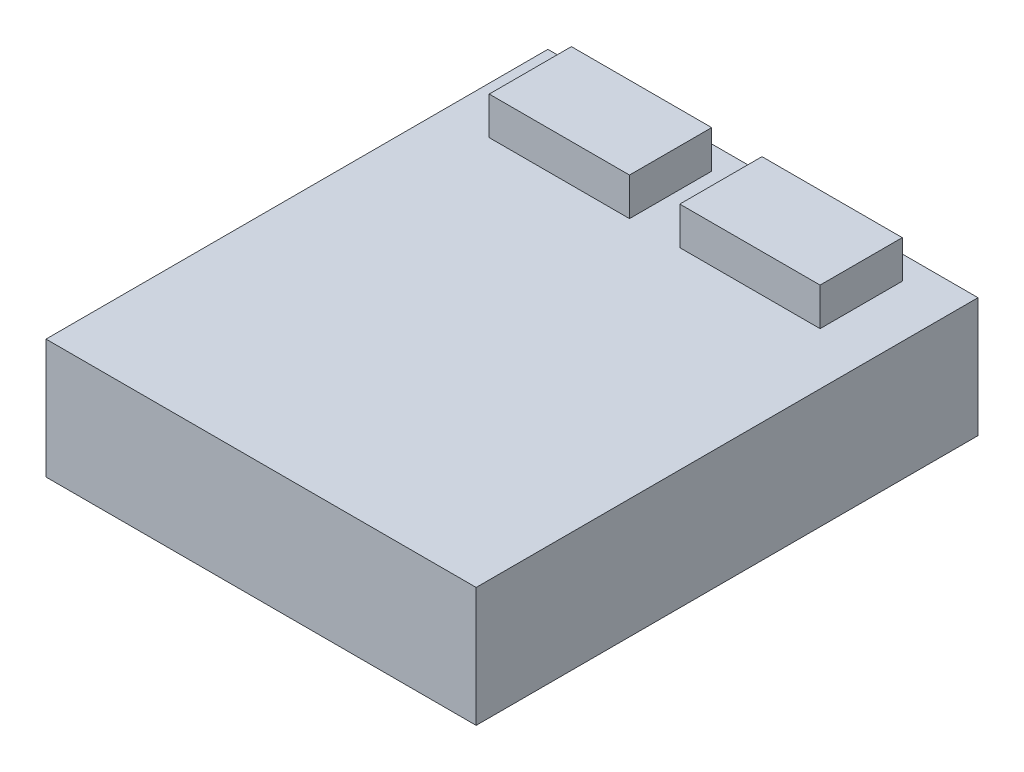
ISO-10303-21;
HEADER;
FILE_DESCRIPTION(('STEP AP214'),'2;1');
FILE_NAME('part.step','',(''),(''),'','','');
FILE_SCHEMA(('AUTOMOTIVE_DESIGN { 1 0 10303 214 1 1 1 1 }'));
ENDSEC;
DATA;
#1=APPLICATION_CONTEXT('core data for automotive mechanical design processes');
#2=APPLICATION_PROTOCOL_DEFINITION('international standard','automotive_design',2000,#1);
#3=PRODUCT_CONTEXT('',#1,'mechanical');
#4=PRODUCT('Part','Part','',(#3));
#5=PRODUCT_RELATED_PRODUCT_CATEGORY('part','',(#4));
#6=PRODUCT_DEFINITION_FORMATION('','',#4);
#7=PRODUCT_DEFINITION_CONTEXT('part definition',#1,'design');
#8=PRODUCT_DEFINITION('design','',#6,#7);
#9=PRODUCT_DEFINITION_SHAPE('','',#8);
#10=(LENGTH_UNIT() NAMED_UNIT(*) SI_UNIT(.MILLI.,.METRE.));
#11=(NAMED_UNIT(*) PLANE_ANGLE_UNIT() SI_UNIT($,.RADIAN.));
#12=(NAMED_UNIT(*) SI_UNIT($,.STERADIAN.) SOLID_ANGLE_UNIT());
#13=UNCERTAINTY_MEASURE_WITH_UNIT(LENGTH_MEASURE(1.E-05),#10,'distance_accuracy_value','');
#14=(GEOMETRIC_REPRESENTATION_CONTEXT(3) GLOBAL_UNCERTAINTY_ASSIGNED_CONTEXT((#13)) GLOBAL_UNIT_ASSIGNED_CONTEXT((#10,
#11,#12)) REPRESENTATION_CONTEXT('',''));
#15=CARTESIAN_POINT('',(0.,0.,0.));
#16=DIRECTION('',(0.,0.,1.));
#17=DIRECTION('',(1.,0.,0.));
#18=AXIS2_PLACEMENT_3D('',#15,#16,#17);
#19=CARTESIAN_POINT('',(0.,250.,0.));
#20=DIRECTION('',(0.,-1.,0.));
#21=DIRECTION('',(0.,0.,-1.));
#22=AXIS2_PLACEMENT_3D('',#19,#20,#21);
#23=PLANE('',#22);
#24=DIRECTION('',(0.,0.,1.));
#25=VECTOR('',#24,1.);
#26=CARTESIAN_POINT('',(197.381270116328,250.,-2001.22657109094));
#27=LINE('',#26,#25);
#28=CARTESIAN_POINT('',(197.381270116328,250.,-2001.22657109094));
#29=VERTEX_POINT('',#28);
#30=CARTESIAN_POINT('',(197.381270116328,250.,-1657.32879612678));
#31=VERTEX_POINT('',#30);
#32=EDGE_CURVE('E153',#29,#31,#27,.T.);
#33=ORIENTED_EDGE('',*,*,#32,.F.);
#34=DIRECTION('',(-1.,0.,0.));
#35=VECTOR('',#34,1.);
#36=CARTESIAN_POINT('',(197.381270116328,250.,-2001.22657109094));
#37=LINE('',#36,#35);
#38=CARTESIAN_POINT('',(784.379196348257,250.,-2001.22657109094));
#39=VERTEX_POINT('',#38);
#40=EDGE_CURVE('E169',#39,#29,#37,.T.);
#41=ORIENTED_EDGE('',*,*,#40,.F.);
#42=DIRECTION('',(0.,0.,-1.));
#43=VECTOR('',#42,1.);
#44=CARTESIAN_POINT('',(784.379196348257,250.,-2001.22657109094));
#45=LINE('',#44,#43);
#46=CARTESIAN_POINT('',(784.379196348257,250.,-1657.32879612678));
#47=VERTEX_POINT('',#46);
#48=EDGE_CURVE('E182',#47,#39,#45,.T.);
#49=ORIENTED_EDGE('',*,*,#48,.F.);
#50=DIRECTION('',(1.,0.,0.));
#51=VECTOR('',#50,1.);
#52=CARTESIAN_POINT('',(197.381270116328,250.,-1657.32879612678));
#53=LINE('',#52,#51);
#54=EDGE_CURVE('E158',#31,#47,#53,.T.);
#55=ORIENTED_EDGE('',*,*,#54,.F.);
#56=EDGE_LOOP('',(#33,#41,#49,#55));
#57=FACE_BOUND('',#56,.T.);
#58=DIRECTION('',(0.,0.,1.));
#59=VECTOR('',#58,1.);
#60=CARTESIAN_POINT('',(0.,250.,0.));
#61=LINE('',#60,#59);
#62=CARTESIAN_POINT('',(0.,250.,-2100.));
#63=VERTEX_POINT('',#62);
#64=CARTESIAN_POINT('',(0.,250.,0.));
#65=VERTEX_POINT('',#64);
#66=EDGE_CURVE('E205',#63,#65,#61,.T.);
#67=ORIENTED_EDGE('',*,*,#66,.T.);
#68=DIRECTION('',(1.,0.,0.));
#69=VECTOR('',#68,1.);
#70=CARTESIAN_POINT('',(0.,250.,0.));
#71=LINE('',#70,#69);
#72=CARTESIAN_POINT('',(1800.,250.,0.));
#73=VERTEX_POINT('',#72);
#74=EDGE_CURVE('E209',#65,#73,#71,.T.);
#75=ORIENTED_EDGE('',*,*,#74,.T.);
#76=DIRECTION('',(0.,0.,-1.));
#77=VECTOR('',#76,1.);
#78=CARTESIAN_POINT('',(1800.,250.,0.));
#79=LINE('',#78,#77);
#80=CARTESIAN_POINT('',(1800.,250.,-2100.));
#81=VERTEX_POINT('',#80);
#82=EDGE_CURVE('E213',#73,#81,#79,.T.);
#83=ORIENTED_EDGE('',*,*,#82,.T.);
#84=DIRECTION('',(-1.,0.,0.));
#85=VECTOR('',#84,1.);
#86=CARTESIAN_POINT('',(0.,250.,-2100.));
#87=LINE('',#86,#85);
#88=EDGE_CURVE('E216',#81,#63,#87,.T.);
#89=ORIENTED_EDGE('',*,*,#88,.T.);
#90=EDGE_LOOP('',(#67,#75,#83,#89));
#91=FACE_BOUND('',#90,.T.);
#92=DIRECTION('',(0.,0.,1.));
#93=VECTOR('',#92,1.);
#94=CARTESIAN_POINT('',(994.868351714251,250.,-2001.22657109094));
#95=LINE('',#94,#93);
#96=CARTESIAN_POINT('',(994.868351714251,250.,-2001.22657109094));
#97=VERTEX_POINT('',#96);
#98=CARTESIAN_POINT('',(994.868351714251,250.,-1657.32879612678));
#99=VERTEX_POINT('',#98);
#100=EDGE_CURVE('E151',#97,#99,#95,.T.);
#101=ORIENTED_EDGE('',*,*,#100,.F.);
#102=DIRECTION('',(-1.,0.,0.));
#103=VECTOR('',#102,1.);
#104=CARTESIAN_POINT('',(994.868351714251,250.,-2001.22657109094));
#105=LINE('',#104,#103);
#106=CARTESIAN_POINT('',(1581.86627794618,250.,-2001.22657109094));
#107=VERTEX_POINT('',#106);
#108=EDGE_CURVE('E148',#107,#97,#105,.T.);
#109=ORIENTED_EDGE('',*,*,#108,.F.);
#110=DIRECTION('',(0.,0.,-1.));
#111=VECTOR('',#110,1.);
#112=CARTESIAN_POINT('',(1581.86627794618,250.,-2001.22657109094));
#113=LINE('',#112,#111);
#114=CARTESIAN_POINT('',(1581.86627794618,250.,-1657.32879612678));
#115=VERTEX_POINT('',#114);
#116=EDGE_CURVE('E60',#115,#107,#113,.T.);
#117=ORIENTED_EDGE('',*,*,#116,.F.);
#118=DIRECTION('',(1.,0.,0.));
#119=VECTOR('',#118,1.);
#120=CARTESIAN_POINT('',(994.868351714251,250.,-1657.32879612678));
#121=LINE('',#120,#119);
#122=EDGE_CURVE('E55',#99,#115,#121,.T.);
#123=ORIENTED_EDGE('',*,*,#122,.F.);
#124=EDGE_LOOP('',(#101,#109,#117,#123));
#125=FACE_BOUND('',#124,.T.);
#126=ADVANCED_FACE('F39',(#57,#91,#125),#23,.F.);
#127=CARTESIAN_POINT('',(0.,250.,0.));
#128=DIRECTION('',(1.,0.,0.));
#129=DIRECTION('',(0.,0.,-1.));
#130=AXIS2_PLACEMENT_3D('',#127,#128,#129);
#131=PLANE('',#130);
#132=DIRECTION('',(0.,0.,1.));
#133=VECTOR('',#132,1.);
#134=CARTESIAN_POINT('',(0.,-250.,0.));
#135=LINE('',#134,#133);
#136=CARTESIAN_POINT('',(0.,-250.,-2100.));
#137=VERTEX_POINT('',#136);
#138=CARTESIAN_POINT('',(0.,-250.,0.));
#139=VERTEX_POINT('',#138);
#140=EDGE_CURVE('E204',#137,#139,#135,.T.);
#141=ORIENTED_EDGE('',*,*,#140,.T.);
#142=DIRECTION('',(0.,-1.,0.));
#143=VECTOR('',#142,1.);
#144=CARTESIAN_POINT('',(0.,250.,0.));
#145=LINE('',#144,#143);
#146=EDGE_CURVE('E11',#65,#139,#145,.T.);
#147=ORIENTED_EDGE('',*,*,#146,.F.);
#148=ORIENTED_EDGE('',*,*,#66,.F.);
#149=DIRECTION('',(0.,-1.,0.));
#150=VECTOR('',#149,1.);
#151=CARTESIAN_POINT('',(0.,250.,-2100.));
#152=LINE('',#151,#150);
#153=EDGE_CURVE('E219',#63,#137,#152,.T.);
#154=ORIENTED_EDGE('',*,*,#153,.T.);
#155=EDGE_LOOP('',(#141,#147,#148,#154));
#156=FACE_BOUND('',#155,.T.);
#157=ADVANCED_FACE('F41',(#156),#131,.F.);
#158=CARTESIAN_POINT('',(0.,250.,0.));
#159=DIRECTION('',(0.,0.,-1.));
#160=DIRECTION('',(-1.,0.,0.));
#161=AXIS2_PLACEMENT_3D('',#158,#159,#160);
#162=PLANE('',#161);
#163=DIRECTION('',(1.,0.,0.));
#164=VECTOR('',#163,1.);
#165=CARTESIAN_POINT('',(0.,-250.,0.));
#166=LINE('',#165,#164);
#167=CARTESIAN_POINT('',(1800.,-250.,0.));
#168=VERTEX_POINT('',#167);
#169=EDGE_CURVE('E223',#139,#168,#166,.T.);
#170=ORIENTED_EDGE('',*,*,#169,.T.);
#171=DIRECTION('',(0.,-1.,0.));
#172=VECTOR('',#171,1.);
#173=CARTESIAN_POINT('',(1800.,250.,0.));
#174=LINE('',#173,#172);
#175=EDGE_CURVE('E48',#73,#168,#174,.T.);
#176=ORIENTED_EDGE('',*,*,#175,.F.);
#177=ORIENTED_EDGE('',*,*,#74,.F.);
#178=ORIENTED_EDGE('',*,*,#146,.T.);
#179=EDGE_LOOP('',(#170,#176,#177,#178));
#180=FACE_BOUND('',#179,.T.);
#181=ADVANCED_FACE('F258',(#180),#162,.F.);
#182=CARTESIAN_POINT('',(1800.,250.,0.));
#183=DIRECTION('',(-1.,0.,0.));
#184=DIRECTION('',(0.,0.,1.));
#185=AXIS2_PLACEMENT_3D('',#182,#183,#184);
#186=PLANE('',#185);
#187=DIRECTION('',(0.,0.,-1.));
#188=VECTOR('',#187,1.);
#189=CARTESIAN_POINT('',(1800.,-250.,0.));
#190=LINE('',#189,#188);
#191=CARTESIAN_POINT('',(1800.,-250.,-2100.));
#192=VERTEX_POINT('',#191);
#193=EDGE_CURVE('E226',#168,#192,#190,.T.);
#194=ORIENTED_EDGE('',*,*,#193,.T.);
#195=DIRECTION('',(0.,-1.,0.));
#196=VECTOR('',#195,1.);
#197=CARTESIAN_POINT('',(1800.,250.,-2100.));
#198=LINE('',#197,#196);
#199=EDGE_CURVE('E234',#81,#192,#198,.T.);
#200=ORIENTED_EDGE('',*,*,#199,.F.);
#201=ORIENTED_EDGE('',*,*,#82,.F.);
#202=ORIENTED_EDGE('',*,*,#175,.T.);
#203=EDGE_LOOP('',(#194,#200,#201,#202));
#204=FACE_BOUND('',#203,.T.);
#205=ADVANCED_FACE('F243',(#204),#186,.F.);
#206=CARTESIAN_POINT('',(0.,250.,-2100.));
#207=DIRECTION('',(0.,0.,1.));
#208=DIRECTION('',(1.,0.,0.));
#209=AXIS2_PLACEMENT_3D('',#206,#207,#208);
#210=PLANE('',#209);
#211=DIRECTION('',(-1.,0.,0.));
#212=VECTOR('',#211,1.);
#213=CARTESIAN_POINT('',(0.,-250.,-2100.));
#214=LINE('',#213,#212);
#215=EDGE_CURVE('E210',#192,#137,#214,.T.);
#216=ORIENTED_EDGE('',*,*,#215,.T.);
#217=ORIENTED_EDGE('',*,*,#153,.F.);
#218=ORIENTED_EDGE('',*,*,#88,.F.);
#219=ORIENTED_EDGE('',*,*,#199,.T.);
#220=EDGE_LOOP('',(#216,#217,#218,#219));
#221=FACE_BOUND('',#220,.T.);
#222=ADVANCED_FACE('F252',(#221),#210,.F.);
#223=CARTESIAN_POINT('',(0.,-250.,0.));
#224=DIRECTION('',(0.,-1.,0.));
#225=DIRECTION('',(0.,0.,-1.));
#226=AXIS2_PLACEMENT_3D('',#223,#224,#225);
#227=PLANE('',#226);
#228=ORIENTED_EDGE('',*,*,#140,.F.);
#229=ORIENTED_EDGE('',*,*,#215,.F.);
#230=ORIENTED_EDGE('',*,*,#193,.F.);
#231=ORIENTED_EDGE('',*,*,#169,.F.);
#232=EDGE_LOOP('',(#228,#229,#230,#231));
#233=FACE_BOUND('',#232,.T.);
#234=ADVANCED_FACE('F249',(#233),#227,.T.);
#235=CARTESIAN_POINT('',(197.381270116328,408.,-2001.22657109094));
#236=DIRECTION('',(1.,0.,0.));
#237=DIRECTION('',(0.,0.,-1.));
#238=AXIS2_PLACEMENT_3D('',#235,#236,#237);
#239=PLANE('',#238);
#240=ORIENTED_EDGE('',*,*,#32,.T.);
#241=DIRECTION('',(0.,-1.,0.));
#242=VECTOR('',#241,1.);
#243=CARTESIAN_POINT('',(197.381270116328,408.,-1657.32879612678));
#244=LINE('',#243,#242);
#245=CARTESIAN_POINT('',(197.381270116328,408.,-1657.32879612678));
#246=VERTEX_POINT('',#245);
#247=EDGE_CURVE('E200',#246,#31,#244,.T.);
#248=ORIENTED_EDGE('',*,*,#247,.F.);
#249=DIRECTION('',(0.,0.,1.));
#250=VECTOR('',#249,1.);
#251=CARTESIAN_POINT('',(197.381270116328,408.,-2001.22657109094));
#252=LINE('',#251,#250);
#253=CARTESIAN_POINT('',(197.381270116328,408.,-2001.22657109094));
#254=VERTEX_POINT('',#253);
#255=EDGE_CURVE('E164',#254,#246,#252,.T.);
#256=ORIENTED_EDGE('',*,*,#255,.F.);
#257=DIRECTION('',(0.,-1.,0.));
#258=VECTOR('',#257,1.);
#259=CARTESIAN_POINT('',(197.381270116328,408.,-2001.22657109094));
#260=LINE('',#259,#258);
#261=EDGE_CURVE('E177',#254,#29,#260,.T.);
#262=ORIENTED_EDGE('',*,*,#261,.T.);
#263=EDGE_LOOP('',(#240,#248,#256,#262));
#264=FACE_BOUND('',#263,.T.);
#265=ADVANCED_FACE('F274',(#264),#239,.F.);
#266=CARTESIAN_POINT('',(197.381270116328,408.,-1657.32879612678));
#267=DIRECTION('',(0.,0.,-1.));
#268=DIRECTION('',(-1.,0.,0.));
#269=AXIS2_PLACEMENT_3D('',#266,#267,#268);
#270=PLANE('',#269);
#271=ORIENTED_EDGE('',*,*,#54,.T.);
#272=DIRECTION('',(0.,-1.,0.));
#273=VECTOR('',#272,1.);
#274=CARTESIAN_POINT('',(784.379196348257,408.,-1657.32879612678));
#275=LINE('',#274,#273);
#276=CARTESIAN_POINT('',(784.379196348257,408.,-1657.32879612678));
#277=VERTEX_POINT('',#276);
#278=EDGE_CURVE('E196',#277,#47,#275,.T.);
#279=ORIENTED_EDGE('',*,*,#278,.F.);
#280=DIRECTION('',(1.,0.,0.));
#281=VECTOR('',#280,1.);
#282=CARTESIAN_POINT('',(197.381270116328,408.,-1657.32879612678));
#283=LINE('',#282,#281);
#284=EDGE_CURVE('E168',#246,#277,#283,.T.);
#285=ORIENTED_EDGE('',*,*,#284,.F.);
#286=ORIENTED_EDGE('',*,*,#247,.T.);
#287=EDGE_LOOP('',(#271,#279,#285,#286));
#288=FACE_BOUND('',#287,.T.);
#289=ADVANCED_FACE('F296',(#288),#270,.F.);
#290=CARTESIAN_POINT('',(784.379196348257,408.,-2001.22657109094));
#291=DIRECTION('',(-1.,0.,0.));
#292=DIRECTION('',(0.,0.,1.));
#293=AXIS2_PLACEMENT_3D('',#290,#291,#292);
#294=PLANE('',#293);
#295=ORIENTED_EDGE('',*,*,#48,.T.);
#296=DIRECTION('',(0.,-1.,0.));
#297=VECTOR('',#296,1.);
#298=CARTESIAN_POINT('',(784.379196348257,408.,-2001.22657109094));
#299=LINE('',#298,#297);
#300=CARTESIAN_POINT('',(784.379196348257,408.,-2001.22657109094));
#301=VERTEX_POINT('',#300);
#302=EDGE_CURVE('E192',#301,#39,#299,.T.);
#303=ORIENTED_EDGE('',*,*,#302,.F.);
#304=DIRECTION('',(0.,0.,-1.));
#305=VECTOR('',#304,1.);
#306=CARTESIAN_POINT('',(784.379196348257,408.,-2001.22657109094));
#307=LINE('',#306,#305);
#308=EDGE_CURVE('E172',#277,#301,#307,.T.);
#309=ORIENTED_EDGE('',*,*,#308,.F.);
#310=ORIENTED_EDGE('',*,*,#278,.T.);
#311=EDGE_LOOP('',(#295,#303,#309,#310));
#312=FACE_BOUND('',#311,.T.);
#313=ADVANCED_FACE('F302',(#312),#294,.F.);
#314=CARTESIAN_POINT('',(197.381270116328,408.,-2001.22657109094));
#315=DIRECTION('',(0.,0.,1.));
#316=DIRECTION('',(1.,0.,0.));
#317=AXIS2_PLACEMENT_3D('',#314,#315,#316);
#318=PLANE('',#317);
#319=ORIENTED_EDGE('',*,*,#40,.T.);
#320=ORIENTED_EDGE('',*,*,#261,.F.);
#321=DIRECTION('',(-1.,0.,0.));
#322=VECTOR('',#321,1.);
#323=CARTESIAN_POINT('',(197.381270116328,408.,-2001.22657109094));
#324=LINE('',#323,#322);
#325=EDGE_CURVE('E175',#301,#254,#324,.T.);
#326=ORIENTED_EDGE('',*,*,#325,.F.);
#327=ORIENTED_EDGE('',*,*,#302,.T.);
#328=EDGE_LOOP('',(#319,#320,#326,#327));
#329=FACE_BOUND('',#328,.T.);
#330=ADVANCED_FACE('F309',(#329),#318,.F.);
#331=CARTESIAN_POINT('',(0.,408.,0.));
#332=DIRECTION('',(0.,1.,0.));
#333=DIRECTION('',(0.,0.,1.));
#334=AXIS2_PLACEMENT_3D('',#331,#332,#333);
#335=PLANE('',#334);
#336=ORIENTED_EDGE('',*,*,#255,.T.);
#337=ORIENTED_EDGE('',*,*,#284,.T.);
#338=ORIENTED_EDGE('',*,*,#308,.T.);
#339=ORIENTED_EDGE('',*,*,#325,.T.);
#340=EDGE_LOOP('',(#336,#337,#338,#339));
#341=FACE_BOUND('',#340,.T.);
#342=ADVANCED_FACE('F317',(#341),#335,.T.);
#343=CARTESIAN_POINT('',(994.868351714251,408.,-2001.22657109094));
#344=DIRECTION('',(1.,0.,0.));
#345=DIRECTION('',(0.,0.,-1.));
#346=AXIS2_PLACEMENT_3D('',#343,#344,#345);
#347=PLANE('',#346);
#348=ORIENTED_EDGE('',*,*,#100,.T.);
#349=DIRECTION('',(0.,-1.,0.));
#350=VECTOR('',#349,1.);
#351=CARTESIAN_POINT('',(994.868351714251,408.,-1657.32879612678));
#352=LINE('',#351,#350);
#353=CARTESIAN_POINT('',(994.868351714251,408.,-1657.32879612678));
#354=VERTEX_POINT('',#353);
#355=EDGE_CURVE('E130',#354,#99,#352,.T.);
#356=ORIENTED_EDGE('',*,*,#355,.F.);
#357=DIRECTION('',(0.,0.,1.));
#358=VECTOR('',#357,1.);
#359=CARTESIAN_POINT('',(994.868351714251,408.,-2001.22657109094));
#360=LINE('',#359,#358);
#361=CARTESIAN_POINT('',(994.868351714251,408.,-2001.22657109094));
#362=VERTEX_POINT('',#361);
#363=EDGE_CURVE('E138',#362,#354,#360,.T.);
#364=ORIENTED_EDGE('',*,*,#363,.F.);
#365=DIRECTION('',(0.,-1.,0.));
#366=VECTOR('',#365,1.);
#367=CARTESIAN_POINT('',(994.868351714251,408.,-2001.22657109094));
#368=LINE('',#367,#366);
#369=EDGE_CURVE('E384',#362,#97,#368,.T.);
#370=ORIENTED_EDGE('',*,*,#369,.T.);
#371=EDGE_LOOP('',(#348,#356,#364,#370));
#372=FACE_BOUND('',#371,.T.);
#373=ADVANCED_FACE('F150',(#372),#347,.F.);
#374=CARTESIAN_POINT('',(994.868351714251,408.,-1657.32879612678));
#375=DIRECTION('',(0.,0.,-1.));
#376=DIRECTION('',(-1.,0.,0.));
#377=AXIS2_PLACEMENT_3D('',#374,#375,#376);
#378=PLANE('',#377);
#379=ORIENTED_EDGE('',*,*,#122,.T.);
#380=DIRECTION('',(0.,-1.,0.));
#381=VECTOR('',#380,1.);
#382=CARTESIAN_POINT('',(1581.86627794618,408.,-1657.32879612678));
#383=LINE('',#382,#381);
#384=CARTESIAN_POINT('',(1581.86627794618,408.,-1657.32879612678));
#385=VERTEX_POINT('',#384);
#386=EDGE_CURVE('E133',#385,#115,#383,.T.);
#387=ORIENTED_EDGE('',*,*,#386,.F.);
#388=DIRECTION('',(1.,0.,0.));
#389=VECTOR('',#388,1.);
#390=CARTESIAN_POINT('',(994.868351714251,408.,-1657.32879612678));
#391=LINE('',#390,#389);
#392=EDGE_CURVE('E126',#354,#385,#391,.T.);
#393=ORIENTED_EDGE('',*,*,#392,.F.);
#394=ORIENTED_EDGE('',*,*,#355,.T.);
#395=EDGE_LOOP('',(#379,#387,#393,#394));
#396=FACE_BOUND('',#395,.T.);
#397=ADVANCED_FACE('F128',(#396),#378,.F.);
#398=CARTESIAN_POINT('',(1581.86627794618,408.,-2001.22657109094));
#399=DIRECTION('',(-1.,0.,0.));
#400=DIRECTION('',(0.,0.,1.));
#401=AXIS2_PLACEMENT_3D('',#398,#399,#400);
#402=PLANE('',#401);
#403=ORIENTED_EDGE('',*,*,#116,.T.);
#404=DIRECTION('',(0.,-1.,0.));
#405=VECTOR('',#404,1.);
#406=CARTESIAN_POINT('',(1581.86627794618,408.,-2001.22657109094));
#407=LINE('',#406,#405);
#408=CARTESIAN_POINT('',(1581.86627794618,408.,-2001.22657109094));
#409=VERTEX_POINT('',#408);
#410=EDGE_CURVE('E160',#409,#107,#407,.T.);
#411=ORIENTED_EDGE('',*,*,#410,.F.);
#412=DIRECTION('',(0.,0.,-1.));
#413=VECTOR('',#412,1.);
#414=CARTESIAN_POINT('',(1581.86627794618,408.,-2001.22657109094));
#415=LINE('',#414,#413);
#416=EDGE_CURVE('E137',#385,#409,#415,.T.);
#417=ORIENTED_EDGE('',*,*,#416,.F.);
#418=ORIENTED_EDGE('',*,*,#386,.T.);
#419=EDGE_LOOP('',(#403,#411,#417,#418));
#420=FACE_BOUND('',#419,.T.);
#421=ADVANCED_FACE('F338',(#420),#402,.F.);
#422=CARTESIAN_POINT('',(994.868351714251,408.,-2001.22657109094));
#423=DIRECTION('',(0.,0.,1.));
#424=DIRECTION('',(1.,0.,0.));
#425=AXIS2_PLACEMENT_3D('',#422,#423,#424);
#426=PLANE('',#425);
#427=ORIENTED_EDGE('',*,*,#108,.T.);
#428=ORIENTED_EDGE('',*,*,#369,.F.);
#429=DIRECTION('',(-1.,0.,0.));
#430=VECTOR('',#429,1.);
#431=CARTESIAN_POINT('',(994.868351714251,408.,-2001.22657109094));
#432=LINE('',#431,#430);
#433=EDGE_CURVE('E143',#409,#362,#432,.T.);
#434=ORIENTED_EDGE('',*,*,#433,.F.);
#435=ORIENTED_EDGE('',*,*,#410,.T.);
#436=EDGE_LOOP('',(#427,#428,#434,#435));
#437=FACE_BOUND('',#436,.T.);
#438=ADVANCED_FACE('F345',(#437),#426,.F.);
#439=CARTESIAN_POINT('',(0.,408.,0.));
#440=DIRECTION('',(0.,1.,0.));
#441=DIRECTION('',(0.,0.,1.));
#442=AXIS2_PLACEMENT_3D('',#439,#440,#441);
#443=PLANE('',#442);
#444=ORIENTED_EDGE('',*,*,#363,.T.);
#445=ORIENTED_EDGE('',*,*,#392,.T.);
#446=ORIENTED_EDGE('',*,*,#416,.T.);
#447=ORIENTED_EDGE('',*,*,#433,.T.);
#448=EDGE_LOOP('',(#444,#445,#446,#447));
#449=FACE_BOUND('',#448,.T.);
#450=ADVANCED_FACE('F141',(#449),#443,.T.);
#451=CLOSED_SHELL('',(#126,#157,#181,#205,#222,#234,#265,#289,#313,#330,#342,#373,#397,#421,
#438,#450));
#452=MANIFOLD_SOLID_BREP('B2',#451);
#453=ADVANCED_BREP_SHAPE_REPRESENTATION('',(#18,#452),#14);
#454=SHAPE_DEFINITION_REPRESENTATION(#9,#453);
ENDSEC;
END-ISO-10303-21;
